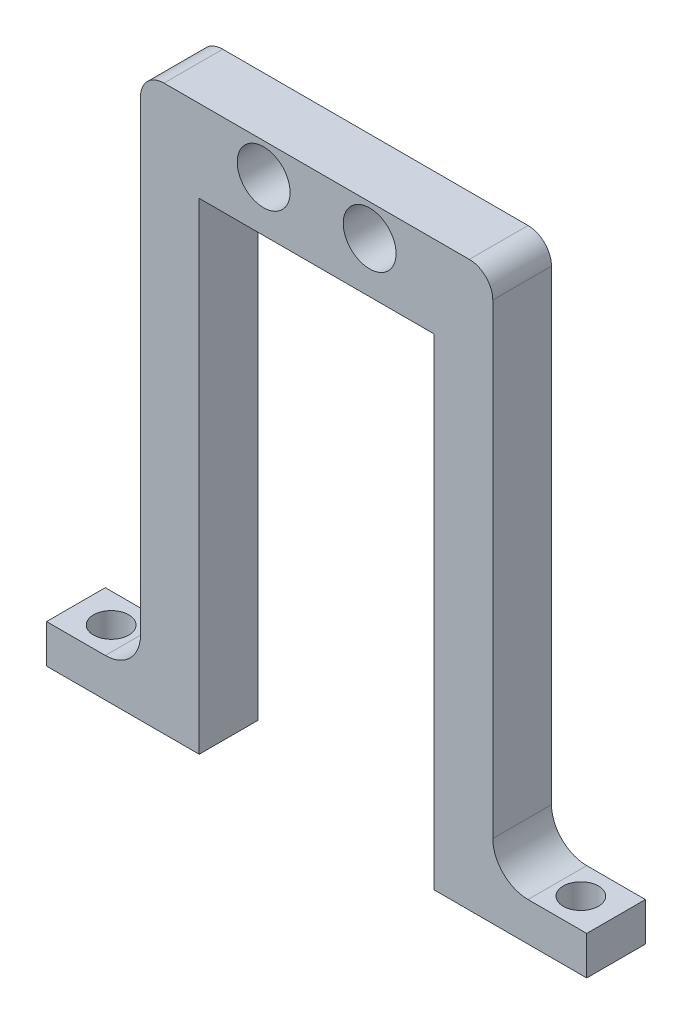
ISO-10303-21;
HEADER;
FILE_DESCRIPTION(('STEP AP214'),'2;1');
FILE_NAME('part.step','',(''),(''),'','','');
FILE_SCHEMA(('AUTOMOTIVE_DESIGN { 1 0 10303 214 1 1 1 1 }'));
ENDSEC;
DATA;
#1=APPLICATION_CONTEXT('core data for automotive mechanical design processes');
#2=APPLICATION_PROTOCOL_DEFINITION('international standard','automotive_design',2000,#1);
#3=PRODUCT_CONTEXT('',#1,'mechanical');
#4=PRODUCT('Part','Part','',(#3));
#5=PRODUCT_RELATED_PRODUCT_CATEGORY('part','',(#4));
#6=PRODUCT_DEFINITION_FORMATION('','',#4);
#7=PRODUCT_DEFINITION_CONTEXT('part definition',#1,'design');
#8=PRODUCT_DEFINITION('design','',#6,#7);
#9=PRODUCT_DEFINITION_SHAPE('','',#8);
#10=(LENGTH_UNIT() NAMED_UNIT(*) SI_UNIT(.MILLI.,.METRE.));
#11=(NAMED_UNIT(*) PLANE_ANGLE_UNIT() SI_UNIT($,.RADIAN.));
#12=(NAMED_UNIT(*) SI_UNIT($,.STERADIAN.) SOLID_ANGLE_UNIT());
#13=UNCERTAINTY_MEASURE_WITH_UNIT(LENGTH_MEASURE(1.E-05),#10,'distance_accuracy_value','');
#14=(GEOMETRIC_REPRESENTATION_CONTEXT(3) GLOBAL_UNCERTAINTY_ASSIGNED_CONTEXT((#13)) GLOBAL_UNIT_ASSIGNED_CONTEXT((#10,
#11,#12)) REPRESENTATION_CONTEXT('',''));
#15=CARTESIAN_POINT('',(0.,0.,0.));
#16=DIRECTION('',(0.,0.,1.));
#17=DIRECTION('',(1.,0.,0.));
#18=AXIS2_PLACEMENT_3D('',#15,#16,#17);
#19=CARTESIAN_POINT('',(-5.,0.,-5.));
#20=DIRECTION('',(1.,0.,0.));
#21=DIRECTION('',(0.,0.,-1.));
#22=AXIS2_PLACEMENT_3D('',#19,#20,#21);
#23=PLANE('',#22);
#24=DIRECTION('',(0.,1.,0.));
#25=VECTOR('',#24,1.);
#26=CARTESIAN_POINT('',(-5.,0.,-5.));
#27=LINE('',#26,#25);
#28=CARTESIAN_POINT('',(-5.,6.28802992720946,-5.));
#29=VERTEX_POINT('',#28);
#30=CARTESIAN_POINT('',(-5.,46.,-5.));
#31=VERTEX_POINT('',#30);
#32=EDGE_CURVE('E153',#29,#31,#27,.T.);
#33=ORIENTED_EDGE('',*,*,#32,.F.);
#34=DIRECTION('',(0.,0.,1.));
#35=VECTOR('',#34,1.);
#36=CARTESIAN_POINT('',(-5.,6.28802992720946,-5.));
#37=LINE('',#36,#35);
#38=CARTESIAN_POINT('',(-5.,6.28802992720946,0.));
#39=VERTEX_POINT('',#38);
#40=EDGE_CURVE('E216',#29,#39,#37,.T.);
#41=ORIENTED_EDGE('',*,*,#40,.T.);
#42=DIRECTION('',(0.,1.,0.));
#43=VECTOR('',#42,1.);
#44=CARTESIAN_POINT('',(-5.,0.,0.));
#45=LINE('',#44,#43);
#46=CARTESIAN_POINT('',(-5.,46.,0.));
#47=VERTEX_POINT('',#46);
#48=EDGE_CURVE('E306',#39,#47,#45,.T.);
#49=ORIENTED_EDGE('',*,*,#48,.T.);
#50=DIRECTION('',(0.,0.,1.));
#51=VECTOR('',#50,1.);
#52=CARTESIAN_POINT('',(-5.,46.,-5.));
#53=LINE('',#52,#51);
#54=EDGE_CURVE('E187',#47,#31,#53,.F.);
#55=ORIENTED_EDGE('',*,*,#54,.T.);
#56=EDGE_LOOP('',(#33,#41,#49,#55));
#57=FACE_BOUND('',#56,.T.);
#58=ADVANCED_FACE('F35',(#57),#23,.F.);
#59=CARTESIAN_POINT('',(0.,48.,-5.));
#60=DIRECTION('',(0.,-1.,0.));
#61=DIRECTION('',(0.,0.,-1.));
#62=AXIS2_PLACEMENT_3D('',#59,#60,#61);
#63=PLANE('',#62);
#64=DIRECTION('',(1.,0.,0.));
#65=VECTOR('',#64,1.);
#66=CARTESIAN_POINT('',(0.,48.,-5.));
#67=LINE('',#66,#65);
#68=CARTESIAN_POINT('',(-3.,48.,-5.));
#69=VERTEX_POINT('',#68);
#70=CARTESIAN_POINT('',(23.,48.,-5.));
#71=VERTEX_POINT('',#70);
#72=EDGE_CURVE('E167',#69,#71,#67,.T.);
#73=ORIENTED_EDGE('',*,*,#72,.F.);
#74=DIRECTION('',(0.,0.,1.));
#75=VECTOR('',#74,1.);
#76=CARTESIAN_POINT('',(-3.,48.,-5.));
#77=LINE('',#76,#75);
#78=CARTESIAN_POINT('',(-3.,48.,0.));
#79=VERTEX_POINT('',#78);
#80=EDGE_CURVE('E178',#69,#79,#77,.T.);
#81=ORIENTED_EDGE('',*,*,#80,.T.);
#82=DIRECTION('',(1.,0.,0.));
#83=VECTOR('',#82,1.);
#84=CARTESIAN_POINT('',(0.,48.,0.));
#85=LINE('',#84,#83);
#86=CARTESIAN_POINT('',(23.,48.,0.));
#87=VERTEX_POINT('',#86);
#88=EDGE_CURVE('E250',#79,#87,#85,.T.);
#89=ORIENTED_EDGE('',*,*,#88,.T.);
#90=DIRECTION('',(0.,0.,1.));
#91=VECTOR('',#90,1.);
#92=CARTESIAN_POINT('',(23.,48.,-5.));
#93=LINE('',#92,#91);
#94=EDGE_CURVE('E176',#87,#71,#93,.F.);
#95=ORIENTED_EDGE('',*,*,#94,.T.);
#96=EDGE_LOOP('',(#73,#81,#89,#95));
#97=FACE_BOUND('',#96,.T.);
#98=ADVANCED_FACE('F342',(#97),#63,.F.);
#99=CARTESIAN_POINT('',(25.,0.,-5.));
#100=DIRECTION('',(1.,0.,0.));
#101=DIRECTION('',(0.,1.,0.));
#102=AXIS2_PLACEMENT_3D('',#99,#100,#101);
#103=PLANE('',#102);
#104=DIRECTION('',(0.,1.,0.));
#105=VECTOR('',#104,1.);
#106=CARTESIAN_POINT('',(25.,0.,0.));
#107=LINE('',#106,#105);
#108=CARTESIAN_POINT('',(25.,6.28802992720946,0.));
#109=VERTEX_POINT('',#108);
#110=CARTESIAN_POINT('',(25.,46.,0.));
#111=VERTEX_POINT('',#110);
#112=EDGE_CURVE('E243',#109,#111,#107,.T.);
#113=ORIENTED_EDGE('',*,*,#112,.F.);
#114=DIRECTION('',(0.,0.,1.));
#115=VECTOR('',#114,1.);
#116=CARTESIAN_POINT('',(25.,6.28802992720946,-5.));
#117=LINE('',#116,#115);
#118=CARTESIAN_POINT('',(25.,6.28802992720946,-5.));
#119=VERTEX_POINT('',#118);
#120=EDGE_CURVE('E214',#109,#119,#117,.F.);
#121=ORIENTED_EDGE('',*,*,#120,.T.);
#122=DIRECTION('',(0.,1.,0.));
#123=VECTOR('',#122,1.);
#124=CARTESIAN_POINT('',(25.,0.,-5.));
#125=LINE('',#124,#123);
#126=CARTESIAN_POINT('',(25.,46.,-5.));
#127=VERTEX_POINT('',#126);
#128=EDGE_CURVE('E172',#119,#127,#125,.T.);
#129=ORIENTED_EDGE('',*,*,#128,.T.);
#130=DIRECTION('',(0.,0.,1.));
#131=VECTOR('',#130,1.);
#132=CARTESIAN_POINT('',(25.,46.,0.));
#133=LINE('',#132,#131);
#134=EDGE_CURVE('E195',#127,#111,#133,.T.);
#135=ORIENTED_EDGE('',*,*,#134,.T.);
#136=EDGE_LOOP('',(#113,#121,#129,#135));
#137=FACE_BOUND('',#136,.T.);
#138=ADVANCED_FACE('F248',(#137),#103,.T.);
#139=CARTESIAN_POINT('',(0.,3.28802992720946,-5.));
#140=DIRECTION('',(0.,-1.,0.));
#141=DIRECTION('',(0.,0.,-1.));
#142=AXIS2_PLACEMENT_3D('',#139,#140,#141);
#143=PLANE('',#142);
#144=CARTESIAN_POINT('',(30.,3.28802992720946,-2.49999999999981));
#145=DIRECTION('',(0.,-1.,0.));
#146=DIRECTION('',(0.,0.,-1.));
#147=AXIS2_PLACEMENT_3D('',#144,#145,#146);
#148=CIRCLE('',#147,1.50000000000001);
#149=CARTESIAN_POINT('',(28.5,3.28802992720946,-2.49999999999981));
#150=VERTEX_POINT('',#149);
#151=EDGE_CURVE('E202',#150,#150,#148,.T.);
#152=ORIENTED_EDGE('',*,*,#151,.T.);
#153=EDGE_LOOP('',(#152));
#154=FACE_BOUND('',#153,.T.);
#155=DIRECTION('',(1.,0.,0.));
#156=VECTOR('',#155,1.);
#157=CARTESIAN_POINT('',(0.,3.28802992720946,-5.));
#158=LINE('',#157,#156);
#159=CARTESIAN_POINT('',(28.,3.28802992720946,-5.));
#160=VERTEX_POINT('',#159);
#161=CARTESIAN_POINT('',(33.,3.28802992720946,-5.));
#162=VERTEX_POINT('',#161);
#163=EDGE_CURVE('E227',#160,#162,#158,.T.);
#164=ORIENTED_EDGE('',*,*,#163,.F.);
#165=DIRECTION('',(0.,0.,1.));
#166=VECTOR('',#165,1.);
#167=CARTESIAN_POINT('',(28.,3.28802992720946,-5.));
#168=LINE('',#167,#166);
#169=CARTESIAN_POINT('',(28.,3.28802992720946,0.));
#170=VERTEX_POINT('',#169);
#171=EDGE_CURVE('E198',#160,#170,#168,.T.);
#172=ORIENTED_EDGE('',*,*,#171,.T.);
#173=DIRECTION('',(1.,0.,0.));
#174=VECTOR('',#173,1.);
#175=CARTESIAN_POINT('',(0.,3.28802992720946,0.));
#176=LINE('',#175,#174);
#177=CARTESIAN_POINT('',(33.,3.28802992720946,0.));
#178=VERTEX_POINT('',#177);
#179=EDGE_CURVE('E246',#170,#178,#176,.T.);
#180=ORIENTED_EDGE('',*,*,#179,.T.);
#181=DIRECTION('',(0.,0.,1.));
#182=VECTOR('',#181,1.);
#183=CARTESIAN_POINT('',(33.,3.28802992720946,-5.));
#184=LINE('',#183,#182);
#185=EDGE_CURVE('E179',#162,#178,#184,.T.);
#186=ORIENTED_EDGE('',*,*,#185,.F.);
#187=EDGE_LOOP('',(#164,#172,#180,#186));
#188=FACE_BOUND('',#187,.T.);
#189=ADVANCED_FACE('F233',(#154,#188),#143,.F.);
#190=CARTESIAN_POINT('',(33.,0.,-5.));
#191=DIRECTION('',(1.,0.,0.));
#192=DIRECTION('',(0.,0.,-1.));
#193=AXIS2_PLACEMENT_3D('',#190,#191,#192);
#194=PLANE('',#193);
#195=DIRECTION('',(0.,1.,0.));
#196=VECTOR('',#195,1.);
#197=CARTESIAN_POINT('',(33.,0.,0.));
#198=LINE('',#197,#196);
#199=CARTESIAN_POINT('',(33.,0.,0.));
#200=VERTEX_POINT('',#199);
#201=EDGE_CURVE('E254',#200,#178,#198,.T.);
#202=ORIENTED_EDGE('',*,*,#201,.F.);
#203=DIRECTION('',(0.,0.,1.));
#204=VECTOR('',#203,1.);
#205=CARTESIAN_POINT('',(33.,0.,-5.));
#206=LINE('',#205,#204);
#207=CARTESIAN_POINT('',(33.,0.,-5.));
#208=VERTEX_POINT('',#207);
#209=EDGE_CURVE('E259',#208,#200,#206,.T.);
#210=ORIENTED_EDGE('',*,*,#209,.F.);
#211=DIRECTION('',(0.,1.,0.));
#212=VECTOR('',#211,1.);
#213=CARTESIAN_POINT('',(33.,0.,-5.));
#214=LINE('',#213,#212);
#215=EDGE_CURVE('E237',#208,#162,#214,.T.);
#216=ORIENTED_EDGE('',*,*,#215,.T.);
#217=ORIENTED_EDGE('',*,*,#185,.T.);
#218=EDGE_LOOP('',(#202,#210,#216,#217));
#219=FACE_BOUND('',#218,.T.);
#220=ADVANCED_FACE('F296',(#219),#194,.T.);
#221=CARTESIAN_POINT('',(0.,0.,-5.));
#222=DIRECTION('',(0.,-1.,0.));
#223=DIRECTION('',(0.,0.,-1.));
#224=AXIS2_PLACEMENT_3D('',#221,#222,#223);
#225=PLANE('',#224);
#226=CARTESIAN_POINT('',(30.,0.,-2.49999999999981));
#227=DIRECTION('',(0.,1.,0.));
#228=DIRECTION('',(-1.,0.,0.));
#229=AXIS2_PLACEMENT_3D('',#226,#227,#228);
#230=CIRCLE('',#229,1.50000000000001);
#231=CARTESIAN_POINT('',(28.5,0.,-2.49999999999981));
#232=VERTEX_POINT('',#231);
#233=EDGE_CURVE('E211',#232,#232,#230,.T.);
#234=ORIENTED_EDGE('',*,*,#233,.T.);
#235=EDGE_LOOP('',(#234));
#236=FACE_BOUND('',#235,.T.);
#237=DIRECTION('',(1.,0.,0.));
#238=VECTOR('',#237,1.);
#239=CARTESIAN_POINT('',(0.,0.,0.));
#240=LINE('',#239,#238);
#241=CARTESIAN_POINT('',(20.,0.,0.));
#242=VERTEX_POINT('',#241);
#243=EDGE_CURVE('E290',#242,#200,#240,.T.);
#244=ORIENTED_EDGE('',*,*,#243,.F.);
#245=DIRECTION('',(0.,0.,1.));
#246=VECTOR('',#245,1.);
#247=CARTESIAN_POINT('',(20.,0.,-5.));
#248=LINE('',#247,#246);
#249=CARTESIAN_POINT('',(20.,0.,-5.));
#250=VERTEX_POINT('',#249);
#251=EDGE_CURVE('E261',#250,#242,#248,.T.);
#252=ORIENTED_EDGE('',*,*,#251,.F.);
#253=DIRECTION('',(1.,0.,0.));
#254=VECTOR('',#253,1.);
#255=CARTESIAN_POINT('',(0.,0.,-5.));
#256=LINE('',#255,#254);
#257=EDGE_CURVE('E299',#250,#208,#256,.T.);
#258=ORIENTED_EDGE('',*,*,#257,.T.);
#259=ORIENTED_EDGE('',*,*,#209,.T.);
#260=EDGE_LOOP('',(#244,#252,#258,#259));
#261=FACE_BOUND('',#260,.T.);
#262=ADVANCED_FACE('F330',(#236,#261),#225,.T.);
#263=CARTESIAN_POINT('',(20.,0.,-5.));
#264=DIRECTION('',(1.,0.,0.));
#265=DIRECTION('',(0.,0.,-1.));
#266=AXIS2_PLACEMENT_3D('',#263,#264,#265);
#267=PLANE('',#266);
#268=DIRECTION('',(0.,1.,0.));
#269=VECTOR('',#268,1.);
#270=CARTESIAN_POINT('',(20.,0.,0.));
#271=LINE('',#270,#269);
#272=CARTESIAN_POINT('',(20.,41.,0.));
#273=VERTEX_POINT('',#272);
#274=EDGE_CURVE('E287',#242,#273,#271,.T.);
#275=ORIENTED_EDGE('',*,*,#274,.T.);
#276=DIRECTION('',(0.,0.,1.));
#277=VECTOR('',#276,1.);
#278=CARTESIAN_POINT('',(20.,41.,-5.));
#279=LINE('',#278,#277);
#280=CARTESIAN_POINT('',(20.,41.,-5.));
#281=VERTEX_POINT('',#280);
#282=EDGE_CURVE('E263',#281,#273,#279,.T.);
#283=ORIENTED_EDGE('',*,*,#282,.F.);
#284=DIRECTION('',(0.,1.,0.));
#285=VECTOR('',#284,1.);
#286=CARTESIAN_POINT('',(20.,0.,-5.));
#287=LINE('',#286,#285);
#288=EDGE_CURVE('E301',#250,#281,#287,.T.);
#289=ORIENTED_EDGE('',*,*,#288,.F.);
#290=ORIENTED_EDGE('',*,*,#251,.T.);
#291=EDGE_LOOP('',(#275,#283,#289,#290));
#292=FACE_BOUND('',#291,.T.);
#293=ADVANCED_FACE('F326',(#292),#267,.F.);
#294=CARTESIAN_POINT('',(0.,41.,-5.));
#295=DIRECTION('',(0.,-1.,0.));
#296=DIRECTION('',(0.,0.,-1.));
#297=AXIS2_PLACEMENT_3D('',#294,#295,#296);
#298=PLANE('',#297);
#299=DIRECTION('',(1.,0.,0.));
#300=VECTOR('',#299,1.);
#301=CARTESIAN_POINT('',(0.,41.,0.));
#302=LINE('',#301,#300);
#303=CARTESIAN_POINT('',(0.,41.,0.));
#304=VERTEX_POINT('',#303);
#305=EDGE_CURVE('E279',#304,#273,#302,.T.);
#306=ORIENTED_EDGE('',*,*,#305,.F.);
#307=DIRECTION('',(0.,0.,1.));
#308=VECTOR('',#307,1.);
#309=CARTESIAN_POINT('',(0.,41.,-5.));
#310=LINE('',#309,#308);
#311=CARTESIAN_POINT('',(0.,41.,-5.));
#312=VERTEX_POINT('',#311);
#313=EDGE_CURVE('E265',#312,#304,#310,.T.);
#314=ORIENTED_EDGE('',*,*,#313,.F.);
#315=DIRECTION('',(1.,0.,0.));
#316=VECTOR('',#315,1.);
#317=CARTESIAN_POINT('',(0.,41.,-5.));
#318=LINE('',#317,#316);
#319=EDGE_CURVE('E320',#312,#281,#318,.T.);
#320=ORIENTED_EDGE('',*,*,#319,.T.);
#321=ORIENTED_EDGE('',*,*,#282,.T.);
#322=EDGE_LOOP('',(#306,#314,#320,#321));
#323=FACE_BOUND('',#322,.T.);
#324=ADVANCED_FACE('F328',(#323),#298,.T.);
#325=CARTESIAN_POINT('',(0.,0.,-5.));
#326=DIRECTION('',(1.,0.,0.));
#327=DIRECTION('',(0.,0.,-1.));
#328=AXIS2_PLACEMENT_3D('',#325,#326,#327);
#329=PLANE('',#328);
#330=DIRECTION('',(0.,1.,0.));
#331=VECTOR('',#330,1.);
#332=CARTESIAN_POINT('',(0.,0.,0.));
#333=LINE('',#332,#331);
#334=CARTESIAN_POINT('',(0.,0.,0.));
#335=VERTEX_POINT('',#334);
#336=EDGE_CURVE('E275',#335,#304,#333,.T.);
#337=ORIENTED_EDGE('',*,*,#336,.F.);
#338=DIRECTION('',(0.,0.,1.));
#339=VECTOR('',#338,1.);
#340=CARTESIAN_POINT('',(0.,0.,-5.));
#341=LINE('',#340,#339);
#342=CARTESIAN_POINT('',(0.,0.,-5.));
#343=VERTEX_POINT('',#342);
#344=EDGE_CURVE('E169',#343,#335,#341,.T.);
#345=ORIENTED_EDGE('',*,*,#344,.F.);
#346=DIRECTION('',(0.,1.,0.));
#347=VECTOR('',#346,1.);
#348=CARTESIAN_POINT('',(0.,0.,-5.));
#349=LINE('',#348,#347);
#350=EDGE_CURVE('E318',#343,#312,#349,.T.);
#351=ORIENTED_EDGE('',*,*,#350,.T.);
#352=ORIENTED_EDGE('',*,*,#313,.T.);
#353=EDGE_LOOP('',(#337,#345,#351,#352));
#354=FACE_BOUND('',#353,.T.);
#355=ADVANCED_FACE('F276',(#354),#329,.T.);
#356=CARTESIAN_POINT('',(0.,0.,-5.));
#357=DIRECTION('',(0.,-1.,0.));
#358=DIRECTION('',(0.,0.,-1.));
#359=AXIS2_PLACEMENT_3D('',#356,#357,#358);
#360=PLANE('',#359);
#361=CARTESIAN_POINT('',(-10.,0.,-2.49999999999981));
#362=DIRECTION('',(0.,1.,0.));
#363=DIRECTION('',(-1.,0.,0.));
#364=AXIS2_PLACEMENT_3D('',#361,#362,#363);
#365=CIRCLE('',#364,1.5);
#366=CARTESIAN_POINT('',(-11.5,0.,-2.49999999999981));
#367=VERTEX_POINT('',#366);
#368=EDGE_CURVE('E203',#367,#367,#365,.T.);
#369=ORIENTED_EDGE('',*,*,#368,.T.);
#370=EDGE_LOOP('',(#369));
#371=FACE_BOUND('',#370,.T.);
#372=DIRECTION('',(1.,0.,0.));
#373=VECTOR('',#372,1.);
#374=CARTESIAN_POINT('',(0.,0.,0.));
#375=LINE('',#374,#373);
#376=CARTESIAN_POINT('',(-13.,0.,0.));
#377=VERTEX_POINT('',#376);
#378=EDGE_CURVE('E271',#377,#335,#375,.T.);
#379=ORIENTED_EDGE('',*,*,#378,.F.);
#380=DIRECTION('',(0.,0.,1.));
#381=VECTOR('',#380,1.);
#382=CARTESIAN_POINT('',(-13.,0.,-5.));
#383=LINE('',#382,#381);
#384=CARTESIAN_POINT('',(-13.,0.,-5.));
#385=VERTEX_POINT('',#384);
#386=EDGE_CURVE('E166',#385,#377,#383,.T.);
#387=ORIENTED_EDGE('',*,*,#386,.F.);
#388=DIRECTION('',(1.,0.,0.));
#389=VECTOR('',#388,1.);
#390=CARTESIAN_POINT('',(0.,0.,-5.));
#391=LINE('',#390,#389);
#392=EDGE_CURVE('E160',#385,#343,#391,.T.);
#393=ORIENTED_EDGE('',*,*,#392,.T.);
#394=ORIENTED_EDGE('',*,*,#344,.T.);
#395=EDGE_LOOP('',(#379,#387,#393,#394));
#396=FACE_BOUND('',#395,.T.);
#397=ADVANCED_FACE('F269',(#371,#396),#360,.T.);
#398=CARTESIAN_POINT('',(-13.,0.,-5.));
#399=DIRECTION('',(1.,0.,0.));
#400=DIRECTION('',(0.,0.,-1.));
#401=AXIS2_PLACEMENT_3D('',#398,#399,#400);
#402=PLANE('',#401);
#403=DIRECTION('',(0.,1.,0.));
#404=VECTOR('',#403,1.);
#405=CARTESIAN_POINT('',(-13.,0.,0.));
#406=LINE('',#405,#404);
#407=CARTESIAN_POINT('',(-13.,3.28802992720946,0.));
#408=VERTEX_POINT('',#407);
#409=EDGE_CURVE('E165',#377,#408,#406,.T.);
#410=ORIENTED_EDGE('',*,*,#409,.T.);
#411=DIRECTION('',(0.,0.,1.));
#412=VECTOR('',#411,1.);
#413=CARTESIAN_POINT('',(-13.,3.28802992720946,-5.));
#414=LINE('',#413,#412);
#415=CARTESIAN_POINT('',(-13.,3.28802992720946,-5.));
#416=VERTEX_POINT('',#415);
#417=EDGE_CURVE('E148',#416,#408,#414,.T.);
#418=ORIENTED_EDGE('',*,*,#417,.F.);
#419=DIRECTION('',(0.,1.,0.));
#420=VECTOR('',#419,1.);
#421=CARTESIAN_POINT('',(-13.,0.,-5.));
#422=LINE('',#421,#420);
#423=EDGE_CURVE('E152',#385,#416,#422,.T.);
#424=ORIENTED_EDGE('',*,*,#423,.F.);
#425=ORIENTED_EDGE('',*,*,#386,.T.);
#426=EDGE_LOOP('',(#410,#418,#424,#425));
#427=FACE_BOUND('',#426,.T.);
#428=ADVANCED_FACE('F163',(#427),#402,.F.);
#429=CARTESIAN_POINT('',(0.,3.28802992720946,-5.));
#430=DIRECTION('',(0.,1.,0.));
#431=DIRECTION('',(-1.,0.,0.));
#432=AXIS2_PLACEMENT_3D('',#429,#430,#431);
#433=PLANE('',#432);
#434=CARTESIAN_POINT('',(-10.,3.28802992720946,-2.49999999999981));
#435=DIRECTION('',(0.,1.,0.));
#436=DIRECTION('',(-1.,0.,0.));
#437=AXIS2_PLACEMENT_3D('',#434,#435,#436);
#438=CIRCLE('',#437,1.5);
#439=CARTESIAN_POINT('',(-11.5,3.28802992720946,-2.49999999999981));
#440=VERTEX_POINT('',#439);
#441=EDGE_CURVE('E199',#440,#440,#438,.T.);
#442=ORIENTED_EDGE('',*,*,#441,.F.);
#443=EDGE_LOOP('',(#442));
#444=FACE_BOUND('',#443,.T.);
#445=DIRECTION('',(-1.,0.,0.));
#446=VECTOR('',#445,1.);
#447=CARTESIAN_POINT('',(0.,3.28802992720946,0.));
#448=LINE('',#447,#446);
#449=CARTESIAN_POINT('',(-8.,3.28802992720946,0.));
#450=VERTEX_POINT('',#449);
#451=EDGE_CURVE('E282',#450,#408,#448,.T.);
#452=ORIENTED_EDGE('',*,*,#451,.F.);
#453=DIRECTION('',(0.,0.,1.));
#454=VECTOR('',#453,1.);
#455=CARTESIAN_POINT('',(-8.,3.28802992720946,-5.));
#456=LINE('',#455,#454);
#457=CARTESIAN_POINT('',(-8.,3.28802992720946,-5.));
#458=VERTEX_POINT('',#457);
#459=EDGE_CURVE('E50',#450,#458,#456,.F.);
#460=ORIENTED_EDGE('',*,*,#459,.T.);
#461=DIRECTION('',(-1.,0.,0.));
#462=VECTOR('',#461,1.);
#463=CARTESIAN_POINT('',(0.,3.28802992720946,-5.));
#464=LINE('',#463,#462);
#465=EDGE_CURVE('E144',#458,#416,#464,.T.);
#466=ORIENTED_EDGE('',*,*,#465,.T.);
#467=ORIENTED_EDGE('',*,*,#417,.T.);
#468=EDGE_LOOP('',(#452,#460,#466,#467));
#469=FACE_BOUND('',#468,.T.);
#470=ADVANCED_FACE('F146',(#444,#469),#433,.T.);
#471=CARTESIAN_POINT('',(0.,0.,-5.));
#472=DIRECTION('',(0.,0.,1.));
#473=DIRECTION('',(1.,0.,0.));
#474=AXIS2_PLACEMENT_3D('',#471,#472,#473);
#475=PLANE('',#474);
#476=CARTESIAN_POINT('',(14.5135363364578,45.3,-5.));
#477=DIRECTION('',(0.,0.,1.));
#478=DIRECTION('',(1.,0.,0.));
#479=AXIS2_PLACEMENT_3D('',#476,#477,#478);
#480=CIRCLE('',#479,2.25);
#481=CARTESIAN_POINT('',(16.7635363364578,45.3,-5.));
#482=VERTEX_POINT('',#481);
#483=EDGE_CURVE('E208',#482,#482,#480,.T.);
#484=ORIENTED_EDGE('',*,*,#483,.T.);
#485=EDGE_LOOP('',(#484));
#486=FACE_BOUND('',#485,.T.);
#487=CARTESIAN_POINT('',(5.48646366354224,45.3,-5.));
#488=DIRECTION('',(0.,0.,1.));
#489=DIRECTION('',(-1.,0.,0.));
#490=AXIS2_PLACEMENT_3D('',#487,#488,#489);
#491=CIRCLE('',#490,2.25);
#492=CARTESIAN_POINT('',(3.23646366354224,45.3,-5.));
#493=VERTEX_POINT('',#492);
#494=EDGE_CURVE('E554',#493,#493,#491,.T.);
#495=ORIENTED_EDGE('',*,*,#494,.T.);
#496=EDGE_LOOP('',(#495));
#497=FACE_BOUND('',#496,.T.);
#498=ORIENTED_EDGE('',*,*,#465,.F.);
#499=CARTESIAN_POINT('',(-8.,6.28802992720946,-5.));
#500=DIRECTION('',(0.,0.,1.));
#501=DIRECTION('',(1.,0.,0.));
#502=AXIS2_PLACEMENT_3D('',#499,#500,#501);
#503=CIRCLE('',#502,3.);
#504=EDGE_CURVE('E11',#458,#29,#503,.T.);
#505=ORIENTED_EDGE('',*,*,#504,.T.);
#506=ORIENTED_EDGE('',*,*,#32,.T.);
#507=CARTESIAN_POINT('',(-3.,46.,-5.));
#508=DIRECTION('',(0.,0.,1.));
#509=DIRECTION('',(1.,0.,0.));
#510=AXIS2_PLACEMENT_3D('',#507,#508,#509);
#511=CIRCLE('',#510,2.);
#512=EDGE_CURVE('E193',#31,#69,#511,.F.);
#513=ORIENTED_EDGE('',*,*,#512,.T.);
#514=ORIENTED_EDGE('',*,*,#72,.T.);
#515=CARTESIAN_POINT('',(23.,46.,-5.));
#516=DIRECTION('',(0.,0.,1.));
#517=DIRECTION('',(1.,0.,0.));
#518=AXIS2_PLACEMENT_3D('',#515,#516,#517);
#519=CIRCLE('',#518,2.);
#520=EDGE_CURVE('E190',#71,#127,#519,.F.);
#521=ORIENTED_EDGE('',*,*,#520,.T.);
#522=ORIENTED_EDGE('',*,*,#128,.F.);
#523=CARTESIAN_POINT('',(28.,6.28802992720946,-5.));
#524=DIRECTION('',(0.,0.,1.));
#525=DIRECTION('',(1.,0.,0.));
#526=AXIS2_PLACEMENT_3D('',#523,#524,#525);
#527=CIRCLE('',#526,3.);
#528=EDGE_CURVE('E222',#119,#160,#527,.T.);
#529=ORIENTED_EDGE('',*,*,#528,.T.);
#530=ORIENTED_EDGE('',*,*,#163,.T.);
#531=ORIENTED_EDGE('',*,*,#215,.F.);
#532=ORIENTED_EDGE('',*,*,#257,.F.);
#533=ORIENTED_EDGE('',*,*,#288,.T.);
#534=ORIENTED_EDGE('',*,*,#319,.F.);
#535=ORIENTED_EDGE('',*,*,#350,.F.);
#536=ORIENTED_EDGE('',*,*,#392,.F.);
#537=ORIENTED_EDGE('',*,*,#423,.T.);
#538=EDGE_LOOP('',(#498,#505,#506,#513,#514,#521,#522,#529,#530,#531,#532,#533,#534,#535,#536,#537));
#539=FACE_BOUND('',#538,.T.);
#540=ADVANCED_FACE('F157',(#486,#497,#539),#475,.F.);
#541=CARTESIAN_POINT('',(0.,0.,0.));
#542=DIRECTION('',(0.,0.,1.));
#543=DIRECTION('',(1.,0.,0.));
#544=AXIS2_PLACEMENT_3D('',#541,#542,#543);
#545=PLANE('',#544);
#546=CARTESIAN_POINT('',(14.5135363364578,45.3,0.));
#547=DIRECTION('',(0.,0.,1.));
#548=DIRECTION('',(1.,0.,0.));
#549=AXIS2_PLACEMENT_3D('',#546,#547,#548);
#550=CIRCLE('',#549,2.25);
#551=CARTESIAN_POINT('',(16.7635363364578,45.3,0.));
#552=VERTEX_POINT('',#551);
#553=EDGE_CURVE('E207',#552,#552,#550,.T.);
#554=ORIENTED_EDGE('',*,*,#553,.F.);
#555=EDGE_LOOP('',(#554));
#556=FACE_BOUND('',#555,.T.);
#557=CARTESIAN_POINT('',(5.48646366354224,45.3,0.));
#558=DIRECTION('',(0.,0.,1.));
#559=DIRECTION('',(1.,0.,0.));
#560=AXIS2_PLACEMENT_3D('',#557,#558,#559);
#561=CIRCLE('',#560,2.25);
#562=CARTESIAN_POINT('',(7.73646366354224,45.3,0.));
#563=VERTEX_POINT('',#562);
#564=EDGE_CURVE('E204',#563,#563,#561,.T.);
#565=ORIENTED_EDGE('',*,*,#564,.F.);
#566=EDGE_LOOP('',(#565));
#567=FACE_BOUND('',#566,.T.);
#568=ORIENTED_EDGE('',*,*,#88,.F.);
#569=CARTESIAN_POINT('',(-3.,46.,0.));
#570=DIRECTION('',(0.,0.,1.));
#571=DIRECTION('',(1.,0.,0.));
#572=AXIS2_PLACEMENT_3D('',#569,#570,#571);
#573=CIRCLE('',#572,2.);
#574=EDGE_CURVE('E184',#79,#47,#573,.T.);
#575=ORIENTED_EDGE('',*,*,#574,.T.);
#576=ORIENTED_EDGE('',*,*,#48,.F.);
#577=CARTESIAN_POINT('',(-8.,6.28802992720946,0.));
#578=DIRECTION('',(0.,0.,1.));
#579=DIRECTION('',(1.,0.,0.));
#580=AXIS2_PLACEMENT_3D('',#577,#578,#579);
#581=CIRCLE('',#580,3.);
#582=EDGE_CURVE('E43',#39,#450,#581,.F.);
#583=ORIENTED_EDGE('',*,*,#582,.T.);
#584=ORIENTED_EDGE('',*,*,#451,.T.);
#585=ORIENTED_EDGE('',*,*,#409,.F.);
#586=ORIENTED_EDGE('',*,*,#378,.T.);
#587=ORIENTED_EDGE('',*,*,#336,.T.);
#588=ORIENTED_EDGE('',*,*,#305,.T.);
#589=ORIENTED_EDGE('',*,*,#274,.F.);
#590=ORIENTED_EDGE('',*,*,#243,.T.);
#591=ORIENTED_EDGE('',*,*,#201,.T.);
#592=ORIENTED_EDGE('',*,*,#179,.F.);
#593=CARTESIAN_POINT('',(28.,6.28802992720946,0.));
#594=DIRECTION('',(0.,0.,1.));
#595=DIRECTION('',(1.,0.,0.));
#596=AXIS2_PLACEMENT_3D('',#593,#594,#595);
#597=CIRCLE('',#596,3.);
#598=EDGE_CURVE('E220',#170,#109,#597,.F.);
#599=ORIENTED_EDGE('',*,*,#598,.T.);
#600=ORIENTED_EDGE('',*,*,#112,.T.);
#601=CARTESIAN_POINT('',(23.,46.,0.));
#602=DIRECTION('',(0.,0.,1.));
#603=DIRECTION('',(1.,0.,0.));
#604=AXIS2_PLACEMENT_3D('',#601,#602,#603);
#605=CIRCLE('',#604,2.);
#606=EDGE_CURVE('E182',#111,#87,#605,.T.);
#607=ORIENTED_EDGE('',*,*,#606,.T.);
#608=EDGE_LOOP('',(#568,#575,#576,#583,#584,#585,#586,#587,#588,#589,#590,#591,#592,#599,#600,#607));
#609=FACE_BOUND('',#608,.T.);
#610=ADVANCED_FACE('F242',(#556,#567,#609),#545,.T.);
#611=CARTESIAN_POINT('',(-3.,46.,-5.));
#612=DIRECTION('',(0.,0.,1.));
#613=DIRECTION('',(1.,0.,0.));
#614=AXIS2_PLACEMENT_3D('',#611,#612,#613);
#615=CYLINDRICAL_SURFACE('',#614,2.);
#616=ORIENTED_EDGE('',*,*,#512,.F.);
#617=ORIENTED_EDGE('',*,*,#54,.F.);
#618=ORIENTED_EDGE('',*,*,#574,.F.);
#619=ORIENTED_EDGE('',*,*,#80,.F.);
#620=EDGE_LOOP('',(#616,#617,#618,#619));
#621=FACE_BOUND('',#620,.T.);
#622=ADVANCED_FACE('F352',(#621),#615,.T.);
#623=CARTESIAN_POINT('',(23.,46.,-5.));
#624=DIRECTION('',(0.,0.,-1.));
#625=DIRECTION('',(-1.,0.,0.));
#626=AXIS2_PLACEMENT_3D('',#623,#624,#625);
#627=CYLINDRICAL_SURFACE('',#626,2.);
#628=ORIENTED_EDGE('',*,*,#520,.F.);
#629=ORIENTED_EDGE('',*,*,#94,.F.);
#630=ORIENTED_EDGE('',*,*,#606,.F.);
#631=ORIENTED_EDGE('',*,*,#134,.F.);
#632=EDGE_LOOP('',(#628,#629,#630,#631));
#633=FACE_BOUND('',#632,.T.);
#634=ADVANCED_FACE('F355',(#633),#627,.T.);
#635=CARTESIAN_POINT('',(-10.,0.,-2.49999999999981));
#636=DIRECTION('',(0.,1.,0.));
#637=DIRECTION('',(-1.,0.,0.));
#638=AXIS2_PLACEMENT_3D('',#635,#636,#637);
#639=CYLINDRICAL_SURFACE('',#638,1.5);
#640=CARTESIAN_POINT('',(-11.5,3.28802992720946,-2.49999999999981));
#641=CARTESIAN_POINT('',(-11.5,3.25377961546769,-2.49999999999981));
#642=CARTESIAN_POINT('',(-11.5,3.21952930372593,-2.49999999999981));
#643=CARTESIAN_POINT('',(-11.5,3.1510286802424,-2.49999999999981));
#644=CARTESIAN_POINT('',(-11.5,3.11677836850063,-2.49999999999981));
#645=CARTESIAN_POINT('',(-11.5,3.0482777450171,-2.49999999999981));
#646=CARTESIAN_POINT('',(-11.5,3.01402743327534,-2.49999999999981));
#647=CARTESIAN_POINT('',(-11.5,2.94552680979181,-2.49999999999981));
#648=CARTESIAN_POINT('',(-11.5,2.91127649805004,-2.49999999999981));
#649=CARTESIAN_POINT('',(-11.5,2.84277587456651,-2.49999999999981));
#650=CARTESIAN_POINT('',(-11.5,2.80852556282474,-2.49999999999981));
#651=CARTESIAN_POINT('',(-11.5,2.74002493934121,-2.49999999999981));
#652=CARTESIAN_POINT('',(-11.5,2.70577462759945,-2.49999999999981));
#653=CARTESIAN_POINT('',(-11.5,2.63727400411592,-2.49999999999981));
#654=CARTESIAN_POINT('',(-11.5,2.60302369237415,-2.49999999999981));
#655=CARTESIAN_POINT('',(-11.5,2.53452306889062,-2.49999999999981));
#656=CARTESIAN_POINT('',(-11.5,2.50027275714886,-2.49999999999981));
#657=CARTESIAN_POINT('',(-11.5,2.43177213366533,-2.49999999999981));
#658=CARTESIAN_POINT('',(-11.5,2.39752182192356,-2.49999999999981));
#659=CARTESIAN_POINT('',(-11.5,2.32902119844003,-2.49999999999981));
#660=CARTESIAN_POINT('',(-11.5,2.29477088669826,-2.49999999999981));
#661=CARTESIAN_POINT('',(-11.5,2.22627026321473,-2.49999999999981));
#662=CARTESIAN_POINT('',(-11.5,2.19201995147297,-2.49999999999981));
#663=CARTESIAN_POINT('',(-11.5,2.12351932798944,-2.49999999999981));
#664=CARTESIAN_POINT('',(-11.5,2.08926901624767,-2.49999999999981));
#665=CARTESIAN_POINT('',(-11.5,2.02076839276414,-2.49999999999981));
#666=CARTESIAN_POINT('',(-11.5,1.98651808102238,-2.49999999999981));
#667=CARTESIAN_POINT('',(-11.5,1.91801745753885,-2.49999999999981));
#668=CARTESIAN_POINT('',(-11.5,1.88376714579708,-2.49999999999981));
#669=CARTESIAN_POINT('',(-11.5,1.81526652231355,-2.49999999999981));
#670=CARTESIAN_POINT('',(-11.5,1.78101621057179,-2.49999999999981));
#671=CARTESIAN_POINT('',(-11.5,1.71251558708825,-2.49999999999981));
#672=CARTESIAN_POINT('',(-11.5,1.67826527534649,-2.49999999999981));
#673=CARTESIAN_POINT('',(-11.5,1.60976465186296,-2.49999999999981));
#674=CARTESIAN_POINT('',(-11.5,1.57551434012119,-2.49999999999981));
#675=CARTESIAN_POINT('',(-11.5,1.50701371663766,-2.49999999999981));
#676=CARTESIAN_POINT('',(-11.5,1.4727634048959,-2.49999999999981));
#677=CARTESIAN_POINT('',(-11.5,1.40426278141237,-2.49999999999981));
#678=CARTESIAN_POINT('',(-11.5,1.3700124696706,-2.49999999999981));
#679=CARTESIAN_POINT('',(-11.5,1.30151184618707,-2.49999999999981));
#680=CARTESIAN_POINT('',(-11.5,1.26726153444531,-2.49999999999981));
#681=CARTESIAN_POINT('',(-11.5,1.19876091096178,-2.49999999999981));
#682=CARTESIAN_POINT('',(-11.5,1.16451059922001,-2.49999999999981));
#683=CARTESIAN_POINT('',(-11.5,1.09600997573648,-2.49999999999981));
#684=CARTESIAN_POINT('',(-11.5,1.06175966399471,-2.49999999999981));
#685=CARTESIAN_POINT('',(-11.5,0.993259040511184,-2.49999999999981));
#686=CARTESIAN_POINT('',(-11.5,0.959008728769418,-2.49999999999981));
#687=CARTESIAN_POINT('',(-11.5,0.890508105285888,-2.49999999999981));
#688=CARTESIAN_POINT('',(-11.5,0.856257793544122,-2.49999999999981));
#689=CARTESIAN_POINT('',(-11.5,0.787757170060592,-2.49999999999981));
#690=CARTESIAN_POINT('',(-11.5,0.753506858318826,-2.49999999999981));
#691=CARTESIAN_POINT('',(-11.5,0.685006234835296,-2.49999999999981));
#692=CARTESIAN_POINT('',(-11.5,0.650755923093531,-2.49999999999981));
#693=CARTESIAN_POINT('',(-11.5,0.58225529961,-2.49999999999981));
#694=CARTESIAN_POINT('',(-11.5,0.548004987868235,-2.49999999999981));
#695=CARTESIAN_POINT('',(-11.5,0.479504364384704,-2.49999999999981));
#696=CARTESIAN_POINT('',(-11.5,0.445254052642939,-2.49999999999981));
#697=CARTESIAN_POINT('',(-11.5,0.376753429159408,-2.49999999999981));
#698=CARTESIAN_POINT('',(-11.5,0.342503117417643,-2.49999999999981));
#699=CARTESIAN_POINT('',(-11.5,0.274002493934113,-2.49999999999981));
#700=CARTESIAN_POINT('',(-11.5,0.239752182192347,-2.49999999999981));
#701=CARTESIAN_POINT('',(-11.5,0.171251558708817,-2.49999999999981));
#702=CARTESIAN_POINT('',(-11.5,0.137001246967051,-2.49999999999981));
#703=CARTESIAN_POINT('',(-11.5,0.0685006234835209,-2.49999999999981));
#704=CARTESIAN_POINT('',(-11.5,0.0342503117417555,-2.49999999999981));
#705=CARTESIAN_POINT('',(-11.5,0.,-2.49999999999981));
#706=B_SPLINE_CURVE_WITH_KNOTS('',3,(#640,#641,#642,#643,#644,#645,#646,#647,#648,#649,#650,
#651,#652,#653,#654,#655,#656,#657,#658,#659,#660,#661,#662,#663,#664,#665,#666,#667,#668,#669,
#670,#671,#672,#673,#674,#675,#676,#677,#678,#679,#680,#681,#682,#683,#684,#685,#686,#687,#688,
#689,#690,#691,#692,#693,#694,#695,#696,#697,#698,#699,#700,#701,#702,#703,#704,#705),
.UNSPECIFIED.,.F.,.F.,(4,2,2,2,2,2,2,2,2,2,2,2,2,2,2,2,2,2,2,2,2,2,2,2,2,2,2,2,2,2,2,2,4),(0.,
0.102750935225296,0.205501870450592,0.308252805675888,0.411003740901183,0.513754676126479,
0.616505611351776,0.719256546577071,0.822007481802367,0.924758417027663,1.02750935225296,
1.13026028747825,1.23301122270355,1.33576215792885,1.43851309315414,1.54126402837944,
1.64401496360473,1.74676589883003,1.84951683405533,1.95226776928062,2.05501870450592,
2.15776963973121,2.26052057495651,2.3632715101818,2.4660224454071,2.5687733806324,
2.67152431585769,2.77427525108299,2.87702618630828,2.97977712153358,3.08252805675888,
3.18527899198417,3.28802992720947),.UNSPECIFIED.);
#707=EDGE_CURVE('BSEAM358',#440,#367,#706,.T.);
#708=ORIENTED_EDGE('',*,*,#441,.T.);
#709=ORIENTED_EDGE('',*,*,#368,.F.);
#710=ORIENTED_EDGE('',*,*,#707,.T.);
#711=ORIENTED_EDGE('',*,*,#707,.F.);
#712=EDGE_LOOP('',(#708,#710,#709,#711));
#713=FACE_BOUND('',#712,.T.);
#714=ADVANCED_FACE('F358',(#713),#639,.F.);
#715=CARTESIAN_POINT('',(30.,0.,-2.49999999999981));
#716=DIRECTION('',(0.,1.,0.));
#717=DIRECTION('',(-1.,0.,0.));
#718=AXIS2_PLACEMENT_3D('',#715,#716,#717);
#719=CYLINDRICAL_SURFACE('',#718,1.50000000000001);
#720=CARTESIAN_POINT('',(28.5,0.,-2.49999999999981));
#721=CARTESIAN_POINT('',(28.5,0.0342503117417628,-2.49999999999981));
#722=CARTESIAN_POINT('',(28.5,0.068500623483528,-2.49999999999981));
#723=CARTESIAN_POINT('',(28.5,0.137001246967059,-2.49999999999981));
#724=CARTESIAN_POINT('',(28.5,0.171251558708824,-2.49999999999981));
#725=CARTESIAN_POINT('',(28.5,0.239752182192354,-2.49999999999981));
#726=CARTESIAN_POINT('',(28.5,0.274002493934119,-2.49999999999981));
#727=CARTESIAN_POINT('',(28.5,0.34250311741765,-2.49999999999981));
#728=CARTESIAN_POINT('',(28.5,0.376753429159415,-2.49999999999981));
#729=CARTESIAN_POINT('',(28.5,0.445254052642946,-2.49999999999981));
#730=CARTESIAN_POINT('',(28.5,0.479504364384711,-2.49999999999981));
#731=CARTESIAN_POINT('',(28.5,0.548004987868241,-2.49999999999981));
#732=CARTESIAN_POINT('',(28.5,0.582255299610007,-2.49999999999981));
#733=CARTESIAN_POINT('',(28.5,0.650755923093537,-2.49999999999981));
#734=CARTESIAN_POINT('',(28.5,0.685006234835302,-2.49999999999981));
#735=CARTESIAN_POINT('',(28.5,0.753506858318833,-2.49999999999981));
#736=CARTESIAN_POINT('',(28.5,0.787757170060598,-2.49999999999981));
#737=CARTESIAN_POINT('',(28.5,0.856257793544128,-2.49999999999981));
#738=CARTESIAN_POINT('',(28.5,0.890508105285894,-2.49999999999981));
#739=CARTESIAN_POINT('',(28.5,0.959008728769424,-2.49999999999981));
#740=CARTESIAN_POINT('',(28.5,0.99325904051119,-2.49999999999981));
#741=CARTESIAN_POINT('',(28.5,1.06175966399472,-2.49999999999981));
#742=CARTESIAN_POINT('',(28.5,1.09600997573649,-2.49999999999981));
#743=CARTESIAN_POINT('',(28.5,1.16451059922002,-2.49999999999981));
#744=CARTESIAN_POINT('',(28.5,1.19876091096178,-2.49999999999981));
#745=CARTESIAN_POINT('',(28.5,1.26726153444531,-2.49999999999981));
#746=CARTESIAN_POINT('',(28.5,1.30151184618708,-2.49999999999981));
#747=CARTESIAN_POINT('',(28.5,1.37001246967061,-2.49999999999981));
#748=CARTESIAN_POINT('',(28.5,1.40426278141237,-2.49999999999981));
#749=CARTESIAN_POINT('',(28.5,1.4727634048959,-2.49999999999981));
#750=CARTESIAN_POINT('',(28.5,1.50701371663767,-2.49999999999981));
#751=CARTESIAN_POINT('',(28.5,1.5755143401212,-2.49999999999981));
#752=CARTESIAN_POINT('',(28.5,1.60976465186296,-2.49999999999981));
#753=CARTESIAN_POINT('',(28.5,1.67826527534649,-2.49999999999981));
#754=CARTESIAN_POINT('',(28.5,1.71251558708826,-2.49999999999981));
#755=CARTESIAN_POINT('',(28.5,1.78101621057179,-2.49999999999981));
#756=CARTESIAN_POINT('',(28.5,1.81526652231356,-2.49999999999981));
#757=CARTESIAN_POINT('',(28.5,1.88376714579709,-2.49999999999981));
#758=CARTESIAN_POINT('',(28.5,1.91801745753885,-2.49999999999981));
#759=CARTESIAN_POINT('',(28.5,1.98651808102238,-2.49999999999981));
#760=CARTESIAN_POINT('',(28.5,2.02076839276415,-2.49999999999981));
#761=CARTESIAN_POINT('',(28.5,2.08926901624768,-2.49999999999981));
#762=CARTESIAN_POINT('',(28.5,2.12351932798944,-2.49999999999981));
#763=CARTESIAN_POINT('',(28.5,2.19201995147297,-2.49999999999981));
#764=CARTESIAN_POINT('',(28.5,2.22627026321474,-2.49999999999981));
#765=CARTESIAN_POINT('',(28.5,2.29477088669827,-2.49999999999981));
#766=CARTESIAN_POINT('',(28.5,2.32902119844003,-2.49999999999981));
#767=CARTESIAN_POINT('',(28.5,2.39752182192356,-2.49999999999981));
#768=CARTESIAN_POINT('',(28.5,2.43177213366533,-2.49999999999981));
#769=CARTESIAN_POINT('',(28.5,2.50027275714886,-2.49999999999981));
#770=CARTESIAN_POINT('',(28.5,2.53452306889062,-2.49999999999981));
#771=CARTESIAN_POINT('',(28.5,2.60302369237416,-2.49999999999981));
#772=CARTESIAN_POINT('',(28.5,2.63727400411592,-2.49999999999981));
#773=CARTESIAN_POINT('',(28.5,2.70577462759945,-2.49999999999981));
#774=CARTESIAN_POINT('',(28.5,2.74002493934122,-2.49999999999981));
#775=CARTESIAN_POINT('',(28.5,2.80852556282475,-2.49999999999981));
#776=CARTESIAN_POINT('',(28.5,2.84277587456651,-2.49999999999981));
#777=CARTESIAN_POINT('',(28.5,2.91127649805004,-2.49999999999981));
#778=CARTESIAN_POINT('',(28.5,2.94552680979181,-2.49999999999981));
#779=CARTESIAN_POINT('',(28.5,3.01402743327534,-2.49999999999981));
#780=CARTESIAN_POINT('',(28.5,3.0482777450171,-2.49999999999981));
#781=CARTESIAN_POINT('',(28.5,3.11677836850063,-2.49999999999981));
#782=CARTESIAN_POINT('',(28.5,3.1510286802424,-2.49999999999981));
#783=CARTESIAN_POINT('',(28.5,3.21952930372593,-2.49999999999981));
#784=CARTESIAN_POINT('',(28.5,3.2537796154677,-2.49999999999981));
#785=CARTESIAN_POINT('',(28.5,3.28802992720946,-2.49999999999981));
#786=B_SPLINE_CURVE_WITH_KNOTS('',3,(#720,#721,#722,#723,#724,#725,#726,#727,#728,#729,#730,
#731,#732,#733,#734,#735,#736,#737,#738,#739,#740,#741,#742,#743,#744,#745,#746,#747,#748,#749,
#750,#751,#752,#753,#754,#755,#756,#757,#758,#759,#760,#761,#762,#763,#764,#765,#766,#767,#768,
#769,#770,#771,#772,#773,#774,#775,#776,#777,#778,#779,#780,#781,#782,#783,#784,#785),
.UNSPECIFIED.,.F.,.F.,(4,2,2,2,2,2,2,2,2,2,2,2,2,2,2,2,2,2,2,2,2,2,2,2,2,2,2,2,2,2,2,2,4),(0.,
0.102750935225296,0.205501870450591,0.308252805675887,0.411003740901183,0.513754676126479,
0.616505611351774,0.71925654657707,0.822007481802366,0.924758417027661,1.02750935225296,
1.13026028747825,1.23301122270355,1.33576215792884,1.43851309315414,1.54126402837944,
1.64401496360473,1.74676589883003,1.84951683405532,1.95226776928062,2.05501870450591,
2.15776963973121,2.26052057495651,2.3632715101818,2.4660224454071,2.56877338063239,
2.67152431585769,2.77427525108298,2.87702618630828,2.97977712153358,3.08252805675887,
3.18527899198417,3.28802992720946),.UNSPECIFIED.);
#787=EDGE_CURVE('BSEAM372',#232,#150,#786,.T.);
#788=ORIENTED_EDGE('',*,*,#233,.F.);
#789=ORIENTED_EDGE('',*,*,#151,.F.);
#790=ORIENTED_EDGE('',*,*,#787,.T.);
#791=ORIENTED_EDGE('',*,*,#787,.F.);
#792=EDGE_LOOP('',(#788,#790,#789,#791));
#793=FACE_BOUND('',#792,.T.);
#794=ADVANCED_FACE('F372',(#793),#719,.F.);
#795=CARTESIAN_POINT('',(5.48646366354224,45.3,-5.));
#796=DIRECTION('',(0.,0.,1.));
#797=DIRECTION('',(1.,0.,0.));
#798=AXIS2_PLACEMENT_3D('',#795,#796,#797);
#799=CYLINDRICAL_SURFACE('',#798,2.25);
#800=ORIENTED_EDGE('',*,*,#564,.T.);
#801=EDGE_LOOP('',(#800));
#802=FACE_BOUND('',#801,.T.);
#803=ORIENTED_EDGE('',*,*,#494,.F.);
#804=EDGE_LOOP('',(#803));
#805=FACE_BOUND('',#804,.T.);
#806=ADVANCED_FACE('F366',(#802,#805),#799,.F.);
#807=CARTESIAN_POINT('',(14.5135363364578,45.3,-5.));
#808=DIRECTION('',(0.,0.,1.));
#809=DIRECTION('',(1.,0.,0.));
#810=AXIS2_PLACEMENT_3D('',#807,#808,#809);
#811=CYLINDRICAL_SURFACE('',#810,2.25);
#812=ORIENTED_EDGE('',*,*,#553,.T.);
#813=EDGE_LOOP('',(#812));
#814=FACE_BOUND('',#813,.T.);
#815=ORIENTED_EDGE('',*,*,#483,.F.);
#816=EDGE_LOOP('',(#815));
#817=FACE_BOUND('',#816,.T.);
#818=ADVANCED_FACE('F361',(#814,#817),#811,.F.);
#819=CARTESIAN_POINT('',(28.,6.28802992720946,-5.));
#820=DIRECTION('',(0.,0.,1.));
#821=DIRECTION('',(1.,0.,0.));
#822=AXIS2_PLACEMENT_3D('',#819,#820,#821);
#823=CYLINDRICAL_SURFACE('',#822,3.);
#824=ORIENTED_EDGE('',*,*,#528,.F.);
#825=ORIENTED_EDGE('',*,*,#120,.F.);
#826=ORIENTED_EDGE('',*,*,#598,.F.);
#827=ORIENTED_EDGE('',*,*,#171,.F.);
#828=EDGE_LOOP('',(#824,#825,#826,#827));
#829=FACE_BOUND('',#828,.T.);
#830=ADVANCED_FACE('F239',(#829),#823,.F.);
#831=CARTESIAN_POINT('',(-8.,6.28802992720946,-5.));
#832=DIRECTION('',(0.,0.,1.));
#833=DIRECTION('',(1.,0.,0.));
#834=AXIS2_PLACEMENT_3D('',#831,#832,#833);
#835=CYLINDRICAL_SURFACE('',#834,3.);
#836=ORIENTED_EDGE('',*,*,#504,.F.);
#837=ORIENTED_EDGE('',*,*,#459,.F.);
#838=ORIENTED_EDGE('',*,*,#582,.F.);
#839=ORIENTED_EDGE('',*,*,#40,.F.);
#840=EDGE_LOOP('',(#836,#837,#838,#839));
#841=FACE_BOUND('',#840,.T.);
#842=ADVANCED_FACE('F37',(#841),#835,.F.);
#843=CLOSED_SHELL('',(#58,#98,#138,#189,#220,#262,#293,#324,#355,#397,#428,#470,#540,#610,#622,
#634,#714,#794,#806,#818,#830,#842));
#844=MANIFOLD_SOLID_BREP('B2',#843);
#845=ADVANCED_BREP_SHAPE_REPRESENTATION('',(#18,#844),#14);
#846=SHAPE_DEFINITION_REPRESENTATION(#9,#845);
ENDSEC;
END-ISO-10303-21;
